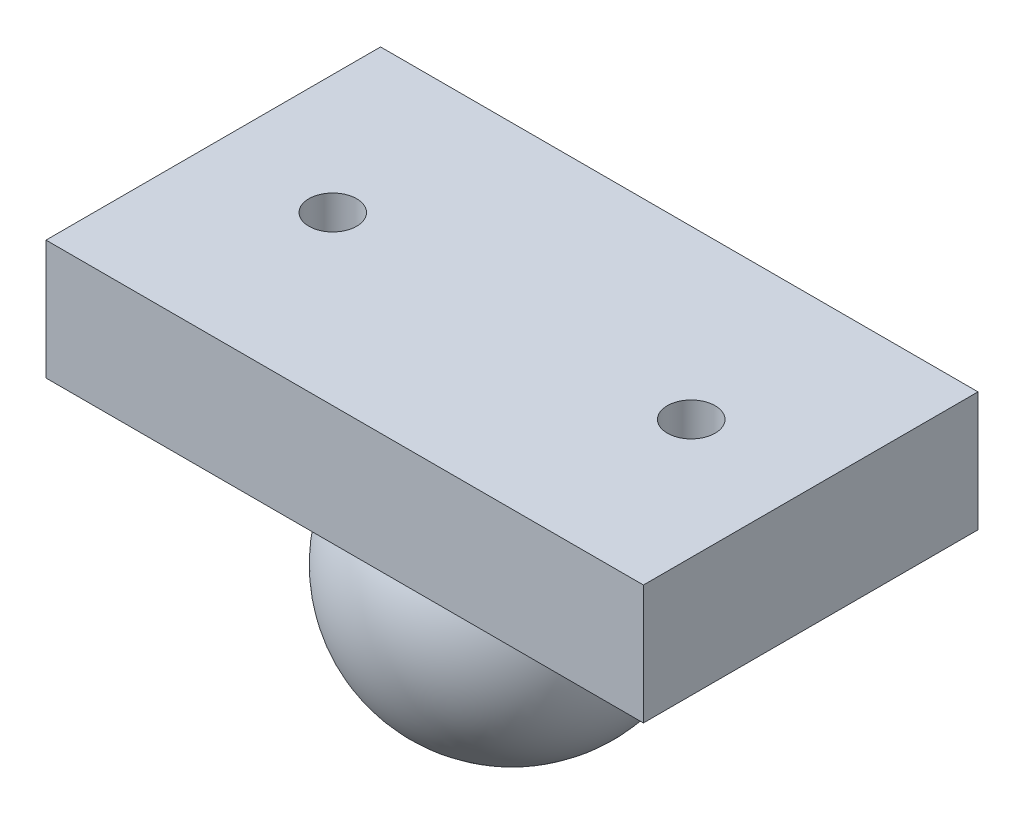
ISO-10303-21;
HEADER;
FILE_DESCRIPTION(('STEP AP214'),'2;1');
FILE_NAME('part.step','',(''),(''),'','','');
FILE_SCHEMA(('AUTOMOTIVE_DESIGN { 1 0 10303 214 1 1 1 1 }'));
ENDSEC;
DATA;
#1=APPLICATION_CONTEXT('core data for automotive mechanical design processes');
#2=APPLICATION_PROTOCOL_DEFINITION('international standard','automotive_design',2000,#1);
#3=PRODUCT_CONTEXT('',#1,'mechanical');
#4=PRODUCT('Part','Part','',(#3));
#5=PRODUCT_RELATED_PRODUCT_CATEGORY('part','',(#4));
#6=PRODUCT_DEFINITION_FORMATION('','',#4);
#7=PRODUCT_DEFINITION_CONTEXT('part definition',#1,'design');
#8=PRODUCT_DEFINITION('design','',#6,#7);
#9=PRODUCT_DEFINITION_SHAPE('','',#8);
#10=(LENGTH_UNIT() NAMED_UNIT(*) SI_UNIT(.MILLI.,.METRE.));
#11=(NAMED_UNIT(*) PLANE_ANGLE_UNIT() SI_UNIT($,.RADIAN.));
#12=(NAMED_UNIT(*) SI_UNIT($,.STERADIAN.) SOLID_ANGLE_UNIT());
#13=UNCERTAINTY_MEASURE_WITH_UNIT(LENGTH_MEASURE(1.E-05),#10,'distance_accuracy_value','');
#14=(GEOMETRIC_REPRESENTATION_CONTEXT(3) GLOBAL_UNCERTAINTY_ASSIGNED_CONTEXT((#13)) GLOBAL_UNIT_ASSIGNED_CONTEXT((#10,
#11,#12)) REPRESENTATION_CONTEXT('',''));
#15=CARTESIAN_POINT('',(0.,0.,0.));
#16=DIRECTION('',(0.,0.,1.));
#17=DIRECTION('',(1.,0.,0.));
#18=AXIS2_PLACEMENT_3D('',#15,#16,#17);
#19=CARTESIAN_POINT('',(0.,5.,0.));
#20=DIRECTION('',(0.,1.,0.));
#21=DIRECTION('',(0.,0.,1.));
#22=AXIS2_PLACEMENT_3D('',#19,#20,#21);
#23=PLANE('',#22);
#24=CARTESIAN_POINT('',(7.5,5.,0.));
#25=DIRECTION('',(0.,1.,0.));
#26=DIRECTION('',(0.,0.,1.));
#27=AXIS2_PLACEMENT_3D('',#24,#25,#26);
#28=CIRCLE('',#27,1.);
#29=CARTESIAN_POINT('',(7.5,5.,0.999999999999997));
#30=VERTEX_POINT('',#29);
#31=EDGE_CURVE('E105',#30,#30,#28,.T.);
#32=ORIENTED_EDGE('',*,*,#31,.F.);
#33=EDGE_LOOP('',(#32));
#34=FACE_BOUND('',#33,.T.);
#35=DIRECTION('',(0.,0.,-1.));
#36=VECTOR('',#35,1.);
#37=CARTESIAN_POINT('',(12.5,5.,-7.));
#38=LINE('',#37,#36);
#39=CARTESIAN_POINT('',(12.5,5.,7.));
#40=VERTEX_POINT('',#39);
#41=CARTESIAN_POINT('',(12.5,5.,-7.));
#42=VERTEX_POINT('',#41);
#43=EDGE_CURVE('E88',#40,#42,#38,.T.);
#44=ORIENTED_EDGE('',*,*,#43,.T.);
#45=DIRECTION('',(-1.,0.,0.));
#46=VECTOR('',#45,1.);
#47=CARTESIAN_POINT('',(-12.5,5.,-7.));
#48=LINE('',#47,#46);
#49=CARTESIAN_POINT('',(-12.5,5.,-7.));
#50=VERTEX_POINT('',#49);
#51=EDGE_CURVE('E83',#42,#50,#48,.T.);
#52=ORIENTED_EDGE('',*,*,#51,.T.);
#53=DIRECTION('',(0.,0.,1.));
#54=VECTOR('',#53,1.);
#55=CARTESIAN_POINT('',(-12.5,5.,-7.));
#56=LINE('',#55,#54);
#57=CARTESIAN_POINT('',(-12.5,5.,7.));
#58=VERTEX_POINT('',#57);
#59=EDGE_CURVE('E86',#50,#58,#56,.T.);
#60=ORIENTED_EDGE('',*,*,#59,.T.);
#61=DIRECTION('',(1.,0.,0.));
#62=VECTOR('',#61,1.);
#63=CARTESIAN_POINT('',(-12.5,5.,7.));
#64=LINE('',#63,#62);
#65=EDGE_CURVE('E52',#58,#40,#64,.T.);
#66=ORIENTED_EDGE('',*,*,#65,.T.);
#67=EDGE_LOOP('',(#44,#52,#60,#66));
#68=FACE_BOUND('',#67,.T.);
#69=CARTESIAN_POINT('',(-7.5,5.,0.));
#70=DIRECTION('',(0.,1.,0.));
#71=DIRECTION('',(0.,0.,1.));
#72=AXIS2_PLACEMENT_3D('',#69,#70,#71);
#73=CIRCLE('',#72,1.);
#74=CARTESIAN_POINT('',(-7.5,5.,0.999999999999998));
#75=VERTEX_POINT('',#74);
#76=EDGE_CURVE('E117',#75,#75,#73,.T.);
#77=ORIENTED_EDGE('',*,*,#76,.F.);
#78=EDGE_LOOP('',(#77));
#79=FACE_BOUND('',#78,.T.);
#80=ADVANCED_FACE('F34',(#34,#68,#79),#23,.T.);
#81=CARTESIAN_POINT('',(0.,0.,0.));
#82=DIRECTION('',(0.,1.,0.));
#83=DIRECTION('',(0.,0.,1.));
#84=AXIS2_PLACEMENT_3D('',#81,#82,#83);
#85=PLANE('',#84);
#86=CARTESIAN_POINT('',(0.,0.,0.));
#87=DIRECTION('',(0.,1.,0.));
#88=DIRECTION('',(0.,0.,1.));
#89=AXIS2_PLACEMENT_3D('',#86,#87,#88);
#90=CIRCLE('',#89,4.47213595499958);
#91=CARTESIAN_POINT('',(0.,0.,4.47213595499958));
#92=VERTEX_POINT('',#91);
#93=EDGE_CURVE('E11',#92,#92,#90,.F.);
#94=ORIENTED_EDGE('',*,*,#93,.F.);
#95=EDGE_LOOP('',(#94));
#96=FACE_BOUND('',#95,.T.);
#97=DIRECTION('',(0.,0.,-1.));
#98=VECTOR('',#97,1.);
#99=CARTESIAN_POINT('',(12.5,0.,-7.));
#100=LINE('',#99,#98);
#101=CARTESIAN_POINT('',(12.5,0.,7.));
#102=VERTEX_POINT('',#101);
#103=CARTESIAN_POINT('',(12.5,0.,-7.));
#104=VERTEX_POINT('',#103);
#105=EDGE_CURVE('E102',#102,#104,#100,.T.);
#106=ORIENTED_EDGE('',*,*,#105,.F.);
#107=DIRECTION('',(1.,0.,0.));
#108=VECTOR('',#107,1.);
#109=CARTESIAN_POINT('',(-12.5,0.,7.));
#110=LINE('',#109,#108);
#111=CARTESIAN_POINT('',(-12.5,0.,7.));
#112=VERTEX_POINT('',#111);
#113=EDGE_CURVE('E75',#112,#102,#110,.T.);
#114=ORIENTED_EDGE('',*,*,#113,.F.);
#115=DIRECTION('',(0.,0.,1.));
#116=VECTOR('',#115,1.);
#117=CARTESIAN_POINT('',(-12.5,0.,-7.));
#118=LINE('',#117,#116);
#119=CARTESIAN_POINT('',(-12.5,0.,-7.));
#120=VERTEX_POINT('',#119);
#121=EDGE_CURVE('E69',#120,#112,#118,.T.);
#122=ORIENTED_EDGE('',*,*,#121,.F.);
#123=DIRECTION('',(-1.,0.,0.));
#124=VECTOR('',#123,1.);
#125=CARTESIAN_POINT('',(-12.5,0.,-7.));
#126=LINE('',#125,#124);
#127=EDGE_CURVE('E93',#104,#120,#126,.T.);
#128=ORIENTED_EDGE('',*,*,#127,.F.);
#129=EDGE_LOOP('',(#106,#114,#122,#128));
#130=FACE_BOUND('',#129,.T.);
#131=CARTESIAN_POINT('',(7.5,0.,0.));
#132=DIRECTION('',(0.,1.,0.));
#133=DIRECTION('',(0.,0.,1.));
#134=AXIS2_PLACEMENT_3D('',#131,#132,#133);
#135=CIRCLE('',#134,1.);
#136=CARTESIAN_POINT('',(7.5,0.,0.999999999999997));
#137=VERTEX_POINT('',#136);
#138=EDGE_CURVE('E122',#137,#137,#135,.T.);
#139=ORIENTED_EDGE('',*,*,#138,.T.);
#140=EDGE_LOOP('',(#139));
#141=FACE_BOUND('',#140,.T.);
#142=CARTESIAN_POINT('',(-7.5,0.,0.));
#143=DIRECTION('',(0.,1.,0.));
#144=DIRECTION('',(0.,0.,1.));
#145=AXIS2_PLACEMENT_3D('',#142,#143,#144);
#146=CIRCLE('',#145,1.);
#147=CARTESIAN_POINT('',(-7.5,0.,0.999999999999998));
#148=VERTEX_POINT('',#147);
#149=EDGE_CURVE('E113',#148,#148,#146,.T.);
#150=ORIENTED_EDGE('',*,*,#149,.T.);
#151=EDGE_LOOP('',(#150));
#152=FACE_BOUND('',#151,.T.);
#153=ADVANCED_FACE('F130',(#96,#130,#141,#152),#85,.F.);
#154=CARTESIAN_POINT('',(12.5,5.,-7.));
#155=DIRECTION('',(-1.,0.,0.));
#156=DIRECTION('',(0.,0.,1.));
#157=AXIS2_PLACEMENT_3D('',#154,#155,#156);
#158=PLANE('',#157);
#159=ORIENTED_EDGE('',*,*,#105,.T.);
#160=DIRECTION('',(0.,-1.,0.));
#161=VECTOR('',#160,1.);
#162=CARTESIAN_POINT('',(12.5,5.,-7.));
#163=LINE('',#162,#161);
#164=EDGE_CURVE('E44',#42,#104,#163,.T.);
#165=ORIENTED_EDGE('',*,*,#164,.F.);
#166=ORIENTED_EDGE('',*,*,#43,.F.);
#167=DIRECTION('',(0.,-1.,0.));
#168=VECTOR('',#167,1.);
#169=CARTESIAN_POINT('',(12.5,5.,7.));
#170=LINE('',#169,#168);
#171=EDGE_CURVE('E98',#40,#102,#170,.T.);
#172=ORIENTED_EDGE('',*,*,#171,.T.);
#173=EDGE_LOOP('',(#159,#165,#166,#172));
#174=FACE_BOUND('',#173,.T.);
#175=ADVANCED_FACE('F36',(#174),#158,.F.);
#176=CARTESIAN_POINT('',(-12.5,5.,-7.));
#177=DIRECTION('',(0.,0.,1.));
#178=DIRECTION('',(1.,0.,0.));
#179=AXIS2_PLACEMENT_3D('',#176,#177,#178);
#180=PLANE('',#179);
#181=ORIENTED_EDGE('',*,*,#127,.T.);
#182=DIRECTION('',(0.,-1.,0.));
#183=VECTOR('',#182,1.);
#184=CARTESIAN_POINT('',(-12.5,5.,-7.));
#185=LINE('',#184,#183);
#186=EDGE_CURVE('E91',#50,#120,#185,.T.);
#187=ORIENTED_EDGE('',*,*,#186,.F.);
#188=ORIENTED_EDGE('',*,*,#51,.F.);
#189=ORIENTED_EDGE('',*,*,#164,.T.);
#190=EDGE_LOOP('',(#181,#187,#188,#189));
#191=FACE_BOUND('',#190,.T.);
#192=ADVANCED_FACE('F92',(#191),#180,.F.);
#193=CARTESIAN_POINT('',(-12.5,5.,-7.));
#194=DIRECTION('',(1.,0.,0.));
#195=DIRECTION('',(0.,0.,-1.));
#196=AXIS2_PLACEMENT_3D('',#193,#194,#195);
#197=PLANE('',#196);
#198=ORIENTED_EDGE('',*,*,#121,.T.);
#199=DIRECTION('',(0.,-1.,0.));
#200=VECTOR('',#199,1.);
#201=CARTESIAN_POINT('',(-12.5,5.,7.));
#202=LINE('',#201,#200);
#203=EDGE_CURVE('E94',#58,#112,#202,.T.);
#204=ORIENTED_EDGE('',*,*,#203,.F.);
#205=ORIENTED_EDGE('',*,*,#59,.F.);
#206=ORIENTED_EDGE('',*,*,#186,.T.);
#207=EDGE_LOOP('',(#198,#204,#205,#206));
#208=FACE_BOUND('',#207,.T.);
#209=ADVANCED_FACE('F96',(#208),#197,.F.);
#210=CARTESIAN_POINT('',(-12.5,5.,7.));
#211=DIRECTION('',(0.,0.,-1.));
#212=DIRECTION('',(-1.,0.,0.));
#213=AXIS2_PLACEMENT_3D('',#210,#211,#212);
#214=PLANE('',#213);
#215=ORIENTED_EDGE('',*,*,#113,.T.);
#216=ORIENTED_EDGE('',*,*,#171,.F.);
#217=ORIENTED_EDGE('',*,*,#65,.F.);
#218=ORIENTED_EDGE('',*,*,#203,.T.);
#219=EDGE_LOOP('',(#215,#216,#217,#218));
#220=FACE_BOUND('',#219,.T.);
#221=ADVANCED_FACE('F135',(#220),#214,.F.);
#222=CARTESIAN_POINT('',(7.5,5.,0.));
#223=DIRECTION('',(0.,-1.,0.));
#224=DIRECTION('',(0.,0.,-1.));
#225=AXIS2_PLACEMENT_3D('',#222,#223,#224);
#226=CYLINDRICAL_SURFACE('',#225,1.);
#227=ORIENTED_EDGE('',*,*,#31,.T.);
#228=EDGE_LOOP('',(#227));
#229=FACE_BOUND('',#228,.T.);
#230=ORIENTED_EDGE('',*,*,#138,.F.);
#231=EDGE_LOOP('',(#230));
#232=FACE_BOUND('',#231,.T.);
#233=ADVANCED_FACE('F132',(#229,#232),#226,.F.);
#234=CARTESIAN_POINT('',(-7.5,5.,0.));
#235=DIRECTION('',(0.,-1.,0.));
#236=DIRECTION('',(0.,0.,-1.));
#237=AXIS2_PLACEMENT_3D('',#234,#235,#236);
#238=CYLINDRICAL_SURFACE('',#237,1.);
#239=ORIENTED_EDGE('',*,*,#76,.T.);
#240=EDGE_LOOP('',(#239));
#241=FACE_BOUND('',#240,.T.);
#242=ORIENTED_EDGE('',*,*,#149,.F.);
#243=EDGE_LOOP('',(#242));
#244=FACE_BOUND('',#243,.T.);
#245=ADVANCED_FACE('F134',(#241,#244),#238,.F.);
#246=CARTESIAN_POINT('',(0.,-4.,0.));
#247=DIRECTION('',(0.,1.,0.));
#248=DIRECTION('',(1.,0.,0.));
#249=AXIS2_PLACEMENT_3D('',#246,#247,#248);
#250=SPHERICAL_SURFACE('',#249,6.);
#251=ORIENTED_EDGE('',*,*,#93,.T.);
#252=EDGE_LOOP('',(#251));
#253=FACE_BOUND('',#252,.T.);
#254=ADVANCED_FACE('F142',(#253),#250,.T.);
#255=CLOSED_SHELL('',(#80,#153,#175,#192,#209,#221,#233,#245,#254));
#256=CARTESIAN_POINT('',(0.,-4.,0.));
#257=DIRECTION('',(0.,1.,0.));
#258=DIRECTION('',(-1.,0.,0.));
#259=AXIS2_PLACEMENT_3D('',#256,#257,#258);
#260=SPHERICAL_SURFACE('',#259,5.);
#261=CARTESIAN_POINT('',(0.,0.,0.));
#262=DIRECTION('',(0.,1.,0.));
#263=DIRECTION('',(0.,0.,1.));
#264=AXIS2_PLACEMENT_3D('',#261,#262,#263);
#265=CIRCLE('',#264,3.);
#266=CARTESIAN_POINT('',(0.,0.,3.));
#267=VERTEX_POINT('',#266);
#268=EDGE_CURVE('E111',#267,#267,#265,.F.);
#269=ORIENTED_EDGE('',*,*,#268,.F.);
#270=EDGE_LOOP('',(#269));
#271=FACE_BOUND('',#270,.T.);
#272=ADVANCED_FACE('F192',(#271),#260,.F.);
#273=ORIENTED_EDGE('',*,*,#268,.T.);
#274=EDGE_LOOP('',(#273));
#275=FACE_BOUND('',#274,.T.);
#276=ADVANCED_FACE('F154',(#275),#85,.F.);
#277=CLOSED_SHELL('',(#272,#276));
#278=ORIENTED_CLOSED_SHELL('',*,#277,.T.);
#279=BREP_WITH_VOIDS('B2',#255,(#278));
#280=ADVANCED_BREP_SHAPE_REPRESENTATION('',(#18,#279),#14);
#281=SHAPE_DEFINITION_REPRESENTATION(#9,#280);
ENDSEC;
END-ISO-10303-21;
